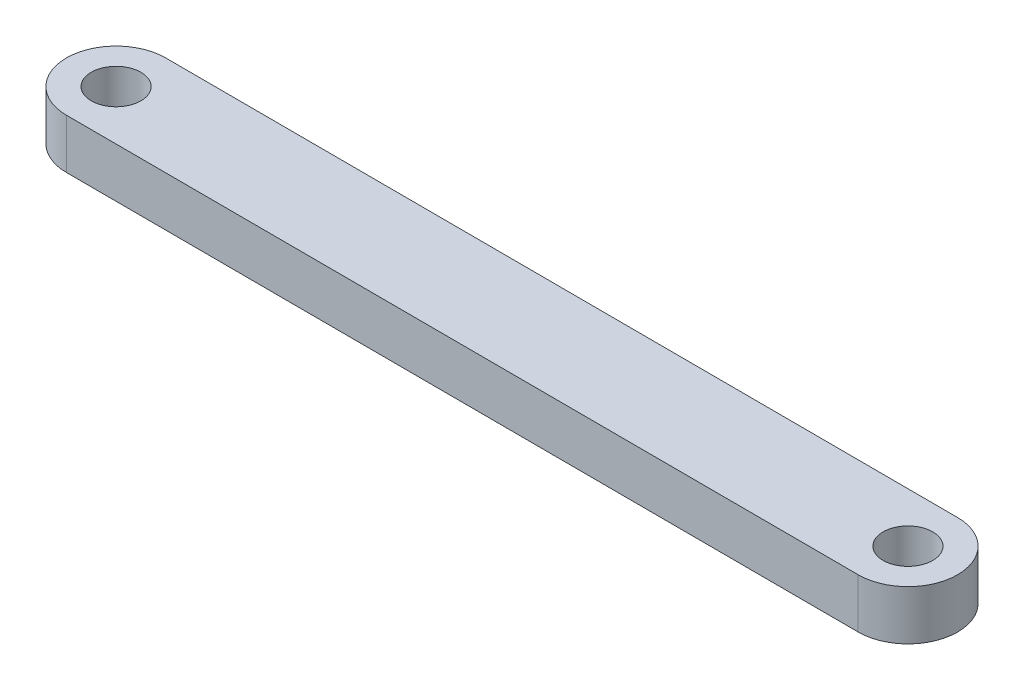
ISO-10303-21;
HEADER;
FILE_DESCRIPTION(('STEP AP214'),'2;1');
FILE_NAME('part.step','',(''),(''),'','','');
FILE_SCHEMA(('AUTOMOTIVE_DESIGN { 1 0 10303 214 1 1 1 1 }'));
ENDSEC;
DATA;
#1=APPLICATION_CONTEXT('core data for automotive mechanical design processes');
#2=APPLICATION_PROTOCOL_DEFINITION('international standard','automotive_design',2000,#1);
#3=PRODUCT_CONTEXT('',#1,'mechanical');
#4=PRODUCT('Part','Part','',(#3));
#5=PRODUCT_RELATED_PRODUCT_CATEGORY('part','',(#4));
#6=PRODUCT_DEFINITION_FORMATION('','',#4);
#7=PRODUCT_DEFINITION_CONTEXT('part definition',#1,'design');
#8=PRODUCT_DEFINITION('design','',#6,#7);
#9=PRODUCT_DEFINITION_SHAPE('','',#8);
#10=(LENGTH_UNIT() NAMED_UNIT(*) SI_UNIT(.MILLI.,.METRE.));
#11=(NAMED_UNIT(*) PLANE_ANGLE_UNIT() SI_UNIT($,.RADIAN.));
#12=(NAMED_UNIT(*) SI_UNIT($,.STERADIAN.) SOLID_ANGLE_UNIT());
#13=UNCERTAINTY_MEASURE_WITH_UNIT(LENGTH_MEASURE(1.E-05),#10,'distance_accuracy_value','');
#14=(GEOMETRIC_REPRESENTATION_CONTEXT(3) GLOBAL_UNCERTAINTY_ASSIGNED_CONTEXT((#13)) GLOBAL_UNIT_ASSIGNED_CONTEXT((#10,
#11,#12)) REPRESENTATION_CONTEXT('',''));
#15=CARTESIAN_POINT('',(0.,0.,0.));
#16=DIRECTION('',(0.,0.,1.));
#17=DIRECTION('',(1.,0.,0.));
#18=AXIS2_PLACEMENT_3D('',#15,#16,#17);
#19=CARTESIAN_POINT('',(-0.680626525223396,5.,3.33954244903061));
#20=DIRECTION('',(0.,-1.,0.));
#21=DIRECTION('',(0.,0.,-1.));
#22=AXIS2_PLACEMENT_3D('',#19,#20,#21);
#23=CYLINDRICAL_SURFACE('',#22,5.);
#24=CARTESIAN_POINT('',(-0.680626525223396,0.,3.33954244903061));
#25=DIRECTION('',(0.,1.,0.));
#26=DIRECTION('',(0.,0.,1.));
#27=AXIS2_PLACEMENT_3D('',#24,#25,#26);
#28=CIRCLE('',#27,5.);
#29=CARTESIAN_POINT('',(-0.667440917064263,0.,-1.66044016491291));
#30=VERTEX_POINT('',#29);
#31=CARTESIAN_POINT('',(-0.693812133382529,0.,8.33952506297413));
#32=VERTEX_POINT('',#31);
#33=EDGE_CURVE('E96',#30,#32,#28,.T.);
#34=ORIENTED_EDGE('',*,*,#33,.T.);
#35=DIRECTION('',(0.,-1.,0.));
#36=VECTOR('',#35,1.);
#37=CARTESIAN_POINT('',(-0.693812133382529,5.,8.33952506297413));
#38=LINE('',#37,#36);
#39=CARTESIAN_POINT('',(-0.693812133382529,5.,8.33952506297413));
#40=VERTEX_POINT('',#39);
#41=EDGE_CURVE('E11',#40,#32,#38,.T.);
#42=ORIENTED_EDGE('',*,*,#41,.F.);
#43=CARTESIAN_POINT('',(-0.680626525223396,5.,3.33954244903061));
#44=DIRECTION('',(0.,1.,0.));
#45=DIRECTION('',(0.,0.,1.));
#46=AXIS2_PLACEMENT_3D('',#43,#44,#45);
#47=CIRCLE('',#46,5.);
#48=CARTESIAN_POINT('',(-0.667440917064263,5.,-1.66044016491291));
#49=VERTEX_POINT('',#48);
#50=EDGE_CURVE('E84',#49,#40,#47,.T.);
#51=ORIENTED_EDGE('',*,*,#50,.F.);
#52=DIRECTION('',(0.,-1.,0.));
#53=VECTOR('',#52,1.);
#54=CARTESIAN_POINT('',(-0.667440917064263,5.,-1.66044016491291));
#55=LINE('',#54,#53);
#56=EDGE_CURVE('E92',#49,#30,#55,.T.);
#57=ORIENTED_EDGE('',*,*,#56,.T.);
#58=EDGE_LOOP('',(#34,#42,#51,#57));
#59=FACE_BOUND('',#58,.T.);
#60=ADVANCED_FACE('F33',(#59),#23,.T.);
#61=CARTESIAN_POINT('',(-0.693812133382529,5.,8.33952506297413));
#62=DIRECTION('',(0.00263712163182667,0.,-0.999996522788704));
#63=DIRECTION('',(-0.999996522788704,0.,-0.00263712163182667));
#64=AXIS2_PLACEMENT_3D('',#61,#62,#63);
#65=PLANE('',#64);
#66=DIRECTION('',(0.999996522788704,0.,0.00263712163182667));
#67=VECTOR('',#66,1.);
#68=CARTESIAN_POINT('',(-0.693812133382529,0.,8.33952506297413));
#69=LINE('',#68,#67);
#70=CARTESIAN_POINT('',(79.3061878666175,0.,8.55049552710915));
#71=VERTEX_POINT('',#70);
#72=EDGE_CURVE('E88',#32,#71,#69,.T.);
#73=ORIENTED_EDGE('',*,*,#72,.T.);
#74=DIRECTION('',(0.,-1.,0.));
#75=VECTOR('',#74,1.);
#76=CARTESIAN_POINT('',(79.3061878666175,5.,8.55049552710915));
#77=LINE('',#76,#75);
#78=CARTESIAN_POINT('',(79.3061878666175,5.,8.55049552710915));
#79=VERTEX_POINT('',#78);
#80=EDGE_CURVE('E41',#79,#71,#77,.T.);
#81=ORIENTED_EDGE('',*,*,#80,.F.);
#82=DIRECTION('',(0.999996522788704,0.,0.00263712163182667));
#83=VECTOR('',#82,1.);
#84=CARTESIAN_POINT('',(-0.693812133382529,5.,8.33952506297413));
#85=LINE('',#84,#83);
#86=EDGE_CURVE('E79',#40,#79,#85,.T.);
#87=ORIENTED_EDGE('',*,*,#86,.F.);
#88=ORIENTED_EDGE('',*,*,#41,.T.);
#89=EDGE_LOOP('',(#73,#81,#87,#88));
#90=FACE_BOUND('',#89,.T.);
#91=ADVANCED_FACE('F87',(#90),#65,.F.);
#92=CARTESIAN_POINT('',(79.3193734747766,5.,3.55051291316563));
#93=DIRECTION('',(0.,-1.,0.));
#94=DIRECTION('',(0.,0.,-1.));
#95=AXIS2_PLACEMENT_3D('',#92,#93,#94);
#96=CYLINDRICAL_SURFACE('',#95,5.);
#97=CARTESIAN_POINT('',(79.3193734747766,0.,3.55051291316563));
#98=DIRECTION('',(0.,1.,0.));
#99=DIRECTION('',(0.,0.,1.));
#100=AXIS2_PLACEMENT_3D('',#97,#98,#99);
#101=CIRCLE('',#100,5.);
#102=CARTESIAN_POINT('',(79.3325590829357,0.,-1.44946970077789));
#103=VERTEX_POINT('',#102);
#104=EDGE_CURVE('E66',#71,#103,#101,.T.);
#105=ORIENTED_EDGE('',*,*,#104,.T.);
#106=DIRECTION('',(0.,-1.,0.));
#107=VECTOR('',#106,1.);
#108=CARTESIAN_POINT('',(79.3325590829357,5.,-1.44946970077789));
#109=LINE('',#108,#107);
#110=CARTESIAN_POINT('',(79.3325590829357,5.,-1.44946970077789));
#111=VERTEX_POINT('',#110);
#112=EDGE_CURVE('E89',#111,#103,#109,.T.);
#113=ORIENTED_EDGE('',*,*,#112,.F.);
#114=CARTESIAN_POINT('',(79.3193734747766,5.,3.55051291316563));
#115=DIRECTION('',(0.,1.,0.));
#116=DIRECTION('',(0.,0.,1.));
#117=AXIS2_PLACEMENT_3D('',#114,#115,#116);
#118=CIRCLE('',#117,5.);
#119=EDGE_CURVE('E82',#79,#111,#118,.T.);
#120=ORIENTED_EDGE('',*,*,#119,.F.);
#121=ORIENTED_EDGE('',*,*,#80,.T.);
#122=EDGE_LOOP('',(#105,#113,#120,#121));
#123=FACE_BOUND('',#122,.T.);
#124=ADVANCED_FACE('F90',(#123),#96,.T.);
#125=CARTESIAN_POINT('',(-0.667440917064263,5.,-1.66044016491291));
#126=DIRECTION('',(-0.00263712163182667,0.,0.999996522788704));
#127=DIRECTION('',(0.999996522788704,0.,0.00263712163182667));
#128=AXIS2_PLACEMENT_3D('',#125,#126,#127);
#129=PLANE('',#128);
#130=DIRECTION('',(-0.999996522788704,0.,-0.00263712163182667));
#131=VECTOR('',#130,1.);
#132=CARTESIAN_POINT('',(-0.667440917064263,0.,-1.66044016491291));
#133=LINE('',#132,#131);
#134=EDGE_CURVE('E72',#103,#30,#133,.T.);
#135=ORIENTED_EDGE('',*,*,#134,.T.);
#136=ORIENTED_EDGE('',*,*,#56,.F.);
#137=DIRECTION('',(-0.999996522788704,0.,-0.00263712163182667));
#138=VECTOR('',#137,1.);
#139=CARTESIAN_POINT('',(-0.667440917064263,5.,-1.66044016491291));
#140=LINE('',#139,#138);
#141=EDGE_CURVE('E49',#111,#49,#140,.T.);
#142=ORIENTED_EDGE('',*,*,#141,.F.);
#143=ORIENTED_EDGE('',*,*,#112,.T.);
#144=EDGE_LOOP('',(#135,#136,#142,#143));
#145=FACE_BOUND('',#144,.T.);
#146=ADVANCED_FACE('F104',(#145),#129,.F.);
#147=CARTESIAN_POINT('',(-0.680626525223396,5.,3.33954244903061));
#148=DIRECTION('',(0.,1.,0.));
#149=DIRECTION('',(0.,0.,1.));
#150=AXIS2_PLACEMENT_3D('',#147,#148,#149);
#151=PLANE('',#150);
#152=CARTESIAN_POINT('',(-0.680626525223396,5.,3.33954244903061));
#153=DIRECTION('',(0.,1.,0.));
#154=DIRECTION('',(0.,0.,1.));
#155=AXIS2_PLACEMENT_3D('',#152,#153,#154);
#156=CIRCLE('',#155,2.5);
#157=CARTESIAN_POINT('',(-0.680626525223396,5.,5.83954244903061));
#158=VERTEX_POINT('',#157);
#159=EDGE_CURVE('E113',#158,#158,#156,.T.);
#160=ORIENTED_EDGE('',*,*,#159,.F.);
#161=EDGE_LOOP('',(#160));
#162=FACE_BOUND('',#161,.T.);
#163=CARTESIAN_POINT('',(79.3193734747766,5.,3.55051291316563));
#164=DIRECTION('',(0.,1.,0.));
#165=DIRECTION('',(0.,0.,1.));
#166=AXIS2_PLACEMENT_3D('',#163,#164,#165);
#167=CIRCLE('',#166,2.5);
#168=CARTESIAN_POINT('',(79.3193734747766,5.,6.05051291316562));
#169=VERTEX_POINT('',#168);
#170=EDGE_CURVE('E114',#169,#169,#167,.T.);
#171=ORIENTED_EDGE('',*,*,#170,.F.);
#172=EDGE_LOOP('',(#171));
#173=FACE_BOUND('',#172,.T.);
#174=ORIENTED_EDGE('',*,*,#50,.T.);
#175=ORIENTED_EDGE('',*,*,#86,.T.);
#176=ORIENTED_EDGE('',*,*,#119,.T.);
#177=ORIENTED_EDGE('',*,*,#141,.T.);
#178=EDGE_LOOP('',(#174,#175,#176,#177));
#179=FACE_BOUND('',#178,.T.);
#180=ADVANCED_FACE('F80',(#162,#173,#179),#151,.T.);
#181=CARTESIAN_POINT('',(-0.680626525223396,0.,3.33954244903061));
#182=DIRECTION('',(0.,1.,0.));
#183=DIRECTION('',(0.,0.,1.));
#184=AXIS2_PLACEMENT_3D('',#181,#182,#183);
#185=PLANE('',#184);
#186=CARTESIAN_POINT('',(-0.680626525223396,0.,3.33954244903061));
#187=DIRECTION('',(0.,1.,0.));
#188=DIRECTION('',(0.,0.,1.));
#189=AXIS2_PLACEMENT_3D('',#186,#187,#188);
#190=CIRCLE('',#189,2.5);
#191=CARTESIAN_POINT('',(-0.680626525223396,0.,5.83954244903061));
#192=VERTEX_POINT('',#191);
#193=EDGE_CURVE('E99',#192,#192,#190,.F.);
#194=ORIENTED_EDGE('',*,*,#193,.F.);
#195=EDGE_LOOP('',(#194));
#196=FACE_BOUND('',#195,.T.);
#197=CARTESIAN_POINT('',(79.3193734747766,0.,3.55051291316563));
#198=DIRECTION('',(0.,1.,0.));
#199=DIRECTION('',(0.,0.,1.));
#200=AXIS2_PLACEMENT_3D('',#197,#198,#199);
#201=CIRCLE('',#200,2.5);
#202=CARTESIAN_POINT('',(79.3193734747766,0.,6.05051291316562));
#203=VERTEX_POINT('',#202);
#204=EDGE_CURVE('E110',#203,#203,#201,.F.);
#205=ORIENTED_EDGE('',*,*,#204,.F.);
#206=EDGE_LOOP('',(#205));
#207=FACE_BOUND('',#206,.T.);
#208=ORIENTED_EDGE('',*,*,#33,.F.);
#209=ORIENTED_EDGE('',*,*,#134,.F.);
#210=ORIENTED_EDGE('',*,*,#104,.F.);
#211=ORIENTED_EDGE('',*,*,#72,.F.);
#212=EDGE_LOOP('',(#208,#209,#210,#211));
#213=FACE_BOUND('',#212,.T.);
#214=ADVANCED_FACE('F107',(#196,#207,#213),#185,.F.);
#215=CARTESIAN_POINT('',(79.3193734747766,-0.00100000000000013,3.55051291316563));
#216=DIRECTION('',(0.,1.,0.));
#217=DIRECTION('',(0.,0.,1.));
#218=AXIS2_PLACEMENT_3D('',#215,#216,#217);
#219=CYLINDRICAL_SURFACE('',#218,2.5);
#220=ORIENTED_EDGE('',*,*,#170,.T.);
#221=EDGE_LOOP('',(#220));
#222=FACE_BOUND('',#221,.T.);
#223=ORIENTED_EDGE('',*,*,#204,.T.);
#224=EDGE_LOOP('',(#223));
#225=FACE_BOUND('',#224,.T.);
#226=ADVANCED_FACE('F130',(#222,#225),#219,.F.);
#227=CARTESIAN_POINT('',(-0.680626525223396,-0.00100000000000013,3.33954244903061));
#228=DIRECTION('',(0.,1.,0.));
#229=DIRECTION('',(0.,0.,1.));
#230=AXIS2_PLACEMENT_3D('',#227,#228,#229);
#231=CYLINDRICAL_SURFACE('',#230,2.5);
#232=ORIENTED_EDGE('',*,*,#159,.T.);
#233=EDGE_LOOP('',(#232));
#234=FACE_BOUND('',#233,.T.);
#235=ORIENTED_EDGE('',*,*,#193,.T.);
#236=EDGE_LOOP('',(#235));
#237=FACE_BOUND('',#236,.T.);
#238=ADVANCED_FACE('F122',(#234,#237),#231,.F.);
#239=CLOSED_SHELL('',(#60,#91,#124,#146,#180,#214,#226,#238));
#240=MANIFOLD_SOLID_BREP('B2',#239);
#241=ADVANCED_BREP_SHAPE_REPRESENTATION('',(#18,#240),#14);
#242=SHAPE_DEFINITION_REPRESENTATION(#9,#241);
ENDSEC;
END-ISO-10303-21;
